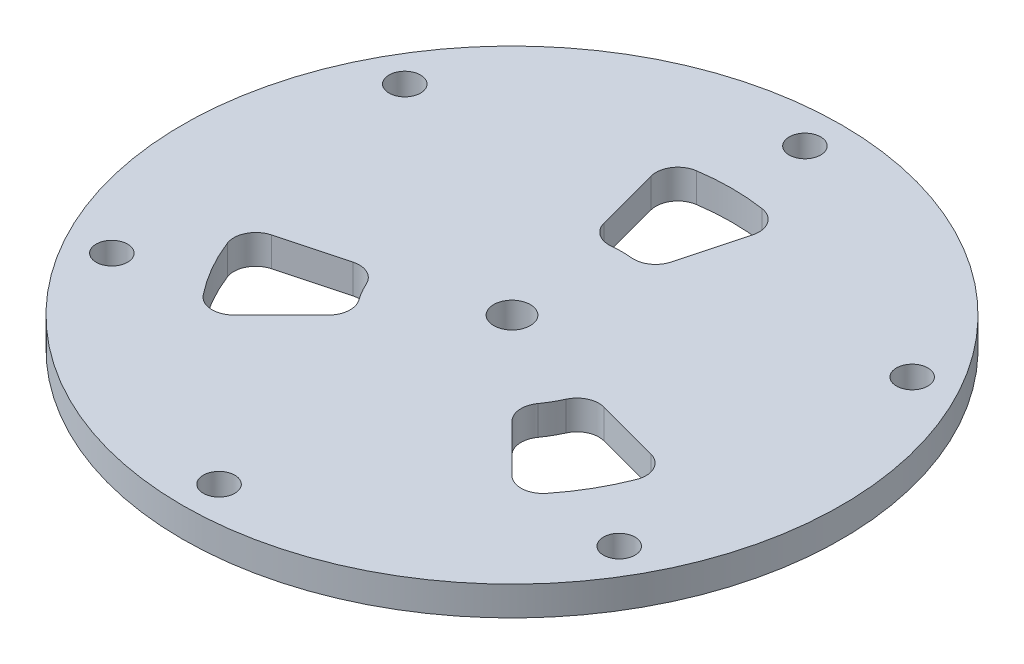
ISO-10303-21;
HEADER;
FILE_DESCRIPTION(('STEP AP214'),'2;1');
FILE_NAME('part.step','',(''),(''),'','','');
FILE_SCHEMA(('AUTOMOTIVE_DESIGN { 1 0 10303 214 1 1 1 1 }'));
ENDSEC;
DATA;
#1=APPLICATION_CONTEXT('core data for automotive mechanical design processes');
#2=APPLICATION_PROTOCOL_DEFINITION('international standard','automotive_design',2000,#1);
#3=PRODUCT_CONTEXT('',#1,'mechanical');
#4=PRODUCT('Part','Part','',(#3));
#5=PRODUCT_RELATED_PRODUCT_CATEGORY('part','',(#4));
#6=PRODUCT_DEFINITION_FORMATION('','',#4);
#7=PRODUCT_DEFINITION_CONTEXT('part definition',#1,'design');
#8=PRODUCT_DEFINITION('design','',#6,#7);
#9=PRODUCT_DEFINITION_SHAPE('','',#8);
#10=(LENGTH_UNIT() NAMED_UNIT(*) SI_UNIT(.MILLI.,.METRE.));
#11=(NAMED_UNIT(*) PLANE_ANGLE_UNIT() SI_UNIT($,.RADIAN.));
#12=(NAMED_UNIT(*) SI_UNIT($,.STERADIAN.) SOLID_ANGLE_UNIT());
#13=UNCERTAINTY_MEASURE_WITH_UNIT(LENGTH_MEASURE(1.E-05),#10,'distance_accuracy_value','');
#14=(GEOMETRIC_REPRESENTATION_CONTEXT(3) GLOBAL_UNCERTAINTY_ASSIGNED_CONTEXT((#13)) GLOBAL_UNIT_ASSIGNED_CONTEXT((#10,
#11,#12)) REPRESENTATION_CONTEXT('',''));
#15=CARTESIAN_POINT('',(0.,0.,0.));
#16=DIRECTION('',(0.,0.,1.));
#17=DIRECTION('',(1.,0.,0.));
#18=AXIS2_PLACEMENT_3D('',#15,#16,#17);
#19=CARTESIAN_POINT('',(0.,2.,0.));
#20=DIRECTION('',(0.,1.,0.));
#21=DIRECTION('',(0.,0.,1.));
#22=AXIS2_PLACEMENT_3D('',#19,#20,#21);
#23=PLANE('',#22);
#24=CARTESIAN_POINT('',(-34.6410161513699,2.,20.0000000000044));
#25=DIRECTION('',(0.,1.,0.));
#26=DIRECTION('',(0.,0.,1.));
#27=AXIS2_PLACEMENT_3D('',#24,#25,#26);
#28=CIRCLE('',#27,2.15);
#29=CARTESIAN_POINT('',(-34.6410161513699,2.,22.1500000000044));
#30=VERTEX_POINT('',#29);
#31=EDGE_CURVE('E384',#30,#30,#28,.T.);
#32=ORIENTED_EDGE('',*,*,#31,.F.);
#33=EDGE_LOOP('',(#32));
#34=FACE_BOUND('',#33,.T.);
#35=CARTESIAN_POINT('',(34.6410161513852,2.,19.9999999999956));
#36=DIRECTION('',(0.,1.,0.));
#37=DIRECTION('',(0.,0.,1.));
#38=AXIS2_PLACEMENT_3D('',#35,#36,#37);
#39=CIRCLE('',#38,2.15);
#40=CARTESIAN_POINT('',(34.6410161513852,2.,22.1499999999956));
#41=VERTEX_POINT('',#40);
#42=EDGE_CURVE('E396',#41,#41,#39,.T.);
#43=ORIENTED_EDGE('',*,*,#42,.F.);
#44=EDGE_LOOP('',(#43));
#45=FACE_BOUND('',#44,.T.);
#46=CARTESIAN_POINT('',(0.,2.,40.));
#47=DIRECTION('',(0.,1.,0.));
#48=DIRECTION('',(0.,0.,-1.));
#49=AXIS2_PLACEMENT_3D('',#46,#47,#48);
#50=CIRCLE('',#49,2.15);
#51=CARTESIAN_POINT('',(0.,2.,37.85));
#52=VERTEX_POINT('',#51);
#53=EDGE_CURVE('E408',#52,#52,#50,.T.);
#54=ORIENTED_EDGE('',*,*,#53,.F.);
#55=EDGE_LOOP('',(#54));
#56=FACE_BOUND('',#55,.T.);
#57=CARTESIAN_POINT('',(0.,2.,0.));
#58=DIRECTION('',(0.,1.,0.));
#59=DIRECTION('',(0.,0.,1.));
#60=AXIS2_PLACEMENT_3D('',#57,#58,#59);
#61=CIRCLE('',#60,45.);
#62=CARTESIAN_POINT('',(0.,2.,45.));
#63=VERTEX_POINT('',#62);
#64=EDGE_CURVE('E11',#63,#63,#61,.T.);
#65=ORIENTED_EDGE('',*,*,#64,.T.);
#66=EDGE_LOOP('',(#65));
#67=FACE_BOUND('',#66,.T.);
#68=CARTESIAN_POINT('',(0.,2.,-40.));
#69=DIRECTION('',(0.,1.,0.));
#70=DIRECTION('',(0.,0.,1.));
#71=AXIS2_PLACEMENT_3D('',#68,#69,#70);
#72=CIRCLE('',#71,2.15);
#73=CARTESIAN_POINT('',(0.,2.,-37.85));
#74=VERTEX_POINT('',#73);
#75=EDGE_CURVE('E414',#74,#74,#72,.T.);
#76=ORIENTED_EDGE('',*,*,#75,.F.);
#77=EDGE_LOOP('',(#76));
#78=FACE_BOUND('',#77,.T.);
#79=CARTESIAN_POINT('',(0.,2.,0.));
#80=DIRECTION('',(0.,1.,0.));
#81=DIRECTION('',(0.,0.,1.));
#82=AXIS2_PLACEMENT_3D('',#79,#80,#81);
#83=CIRCLE('',#82,2.5);
#84=CARTESIAN_POINT('',(0.,2.,2.5));
#85=VERTEX_POINT('',#84);
#86=EDGE_CURVE('E402',#85,#85,#83,.T.);
#87=ORIENTED_EDGE('',*,*,#86,.F.);
#88=EDGE_LOOP('',(#87));
#89=FACE_BOUND('',#88,.T.);
#90=CARTESIAN_POINT('',(-34.6410161513699,2.,-20.0000000000044));
#91=DIRECTION('',(0.,1.,0.));
#92=DIRECTION('',(0.,0.,-1.));
#93=AXIS2_PLACEMENT_3D('',#90,#91,#92);
#94=CIRCLE('',#93,2.15);
#95=CARTESIAN_POINT('',(-34.6410161513699,2.,-22.1500000000044));
#96=VERTEX_POINT('',#95);
#97=EDGE_CURVE('E390',#96,#96,#94,.T.);
#98=ORIENTED_EDGE('',*,*,#97,.F.);
#99=EDGE_LOOP('',(#98));
#100=FACE_BOUND('',#99,.T.);
#101=CARTESIAN_POINT('',(34.6410161513852,2.,-19.9999999999956));
#102=DIRECTION('',(0.,1.,0.));
#103=DIRECTION('',(0.,0.,-1.));
#104=AXIS2_PLACEMENT_3D('',#101,#102,#103);
#105=CIRCLE('',#104,2.15);
#106=CARTESIAN_POINT('',(34.6410161513852,2.,-22.1499999999956));
#107=VERTEX_POINT('',#106);
#108=EDGE_CURVE('E378',#107,#107,#105,.T.);
#109=ORIENTED_EDGE('',*,*,#108,.F.);
#110=EDGE_LOOP('',(#109));
#111=FACE_BOUND('',#110,.T.);
#112=CARTESIAN_POINT('',(0.,2.,0.));
#113=DIRECTION('',(0.,1.,0.));
#114=DIRECTION('',(0.,0.,-1.));
#115=AXIS2_PLACEMENT_3D('',#112,#113,#114);
#116=CIRCLE('',#115,30.);
#117=CARTESIAN_POINT('',(23.4388736717443,2.,18.7248284638342));
#118=VERTEX_POINT('',#117);
#119=CARTESIAN_POINT('',(27.9356139670585,2.,10.9362458039078));
#120=VERTEX_POINT('',#119);
#121=EDGE_CURVE('E321',#118,#120,#116,.T.);
#122=ORIENTED_EDGE('',*,*,#121,.F.);
#123=CARTESIAN_POINT('',(21.0949863045698,2.,16.8523456174508));
#124=DIRECTION('',(0.,1.,0.));
#125=DIRECTION('',(0.,0.,1.));
#126=AXIS2_PLACEMENT_3D('',#123,#124,#125);
#127=CIRCLE('',#126,3.);
#128=CARTESIAN_POINT('',(18.9736659610102,2.,18.9736659610104));
#129=VERTEX_POINT('',#128);
#130=EDGE_CURVE('E319',#129,#118,#127,.T.);
#131=ORIENTED_EDGE('',*,*,#130,.F.);
#132=DIRECTION('',(0.707106781186544,0.,0.707106781186551));
#133=VECTOR('',#132,1.);
#134=CARTESIAN_POINT('',(18.9736659610102,2.,18.9736659610104));
#135=LINE('',#134,#133);
#136=CARTESIAN_POINT('',(12.5499003980111,2.,12.5499003980112));
#137=VERTEX_POINT('',#136);
#138=EDGE_CURVE('E335',#137,#129,#135,.T.);
#139=ORIENTED_EDGE('',*,*,#138,.F.);
#140=CARTESIAN_POINT('',(14.6712207415707,2.,10.4285800544516));
#141=DIRECTION('',(0.,1.,0.));
#142=DIRECTION('',(0.,0.,1.));
#143=AXIS2_PLACEMENT_3D('',#140,#141,#142);
#144=CIRCLE('',#143,3.);
#145=CARTESIAN_POINT('',(12.2260172846423,2.,8.69048337870965));
#146=VERTEX_POINT('',#145);
#147=EDGE_CURVE('E332',#146,#137,#144,.T.);
#148=ORIENTED_EDGE('',*,*,#147,.F.);
#149=CARTESIAN_POINT('',(0.,2.,0.));
#150=DIRECTION('',(0.,-1.,0.));
#151=DIRECTION('',(0.,0.,-1.));
#152=AXIS2_PLACEMENT_3D('',#149,#150,#151);
#153=CIRCLE('',#152,15.);
#154=CARTESIAN_POINT('',(13.6391880194501,2.,6.24279986625309));
#155=VERTEX_POINT('',#154);
#156=EDGE_CURVE('E330',#155,#146,#153,.T.);
#157=ORIENTED_EDGE('',*,*,#156,.F.);
#158=CARTESIAN_POINT('',(16.3670256233401,2.,7.49135983950378));
#159=DIRECTION('',(0.,1.,0.));
#160=DIRECTION('',(0.,0.,-1.));
#161=AXIS2_PLACEMENT_3D('',#158,#159,#160);
#162=CIRCLE('',#161,3.00000000000005);
#163=CARTESIAN_POINT('',(17.1434827586476,2.,4.59358236063654));
#164=VERTEX_POINT('',#163);
#165=EDGE_CURVE('E328',#164,#155,#162,.T.);
#166=ORIENTED_EDGE('',*,*,#165,.F.);
#167=DIRECTION('',(-0.965925826289069,0.,-0.25881904510252));
#168=VECTOR('',#167,1.);
#169=CARTESIAN_POINT('',(25.9185097056601,2.,6.94484374464982));
#170=LINE('',#169,#168);
#171=CARTESIAN_POINT('',(25.9185097056601,2.,6.94484374464982));
#172=VERTEX_POINT('',#171);
#173=EDGE_CURVE('E326',#172,#164,#170,.T.);
#174=ORIENTED_EDGE('',*,*,#173,.F.);
#175=CARTESIAN_POINT('',(25.1420525703525,2.,9.84262122351715));
#176=DIRECTION('',(0.,1.,0.));
#177=DIRECTION('',(0.,0.,1.));
#178=AXIS2_PLACEMENT_3D('',#175,#176,#177);
#179=CIRCLE('',#178,3.00000000000006);
#180=EDGE_CURVE('E324',#120,#172,#179,.T.);
#181=ORIENTED_EDGE('',*,*,#180,.F.);
#182=EDGE_LOOP('',(#122,#131,#139,#148,#157,#166,#174,#181));
#183=FACE_BOUND('',#182,.T.);
#184=CARTESIAN_POINT('',(0.,2.,0.));
#185=DIRECTION('',(0.,1.,0.));
#186=DIRECTION('',(0.,0.,-1.));
#187=AXIS2_PLACEMENT_3D('',#184,#185,#186);
#188=CIRCLE('',#187,30.);
#189=CARTESIAN_POINT('',(-27.9356139670584,2.,10.9362458039078));
#190=VERTEX_POINT('',#189);
#191=CARTESIAN_POINT('',(-23.4388736717445,2.,18.7248284638338));
#192=VERTEX_POINT('',#191);
#193=EDGE_CURVE('E262',#190,#192,#188,.T.);
#194=ORIENTED_EDGE('',*,*,#193,.F.);
#195=CARTESIAN_POINT('',(-25.1420525703527,2.,9.8426212235168));
#196=DIRECTION('',(0.,1.,0.));
#197=DIRECTION('',(0.,0.,1.));
#198=AXIS2_PLACEMENT_3D('',#195,#196,#197);
#199=CIRCLE('',#198,2.99999999999988);
#200=CARTESIAN_POINT('',(-25.9185097056601,2.,6.94484374464982));
#201=VERTEX_POINT('',#200);
#202=EDGE_CURVE('E260',#201,#190,#199,.T.);
#203=ORIENTED_EDGE('',*,*,#202,.F.);
#204=DIRECTION('',(-0.965925826289069,0.,0.25881904510252));
#205=VECTOR('',#204,1.);
#206=CARTESIAN_POINT('',(-25.9185097056601,2.,6.94484374464982));
#207=LINE('',#206,#205);
#208=CARTESIAN_POINT('',(-17.1434827586476,2.,4.59358236063649));
#209=VERTEX_POINT('',#208);
#210=EDGE_CURVE('E276',#209,#201,#207,.T.);
#211=ORIENTED_EDGE('',*,*,#210,.F.);
#212=CARTESIAN_POINT('',(-16.3670256233402,2.,7.49135983950356));
#213=DIRECTION('',(0.,1.,0.));
#214=DIRECTION('',(0.,0.,1.));
#215=AXIS2_PLACEMENT_3D('',#212,#213,#214);
#216=CIRCLE('',#215,2.99999999999992);
#217=CARTESIAN_POINT('',(-13.6391880194501,2.,6.24279986625312));
#218=VERTEX_POINT('',#217);
#219=EDGE_CURVE('E273',#218,#209,#216,.T.);
#220=ORIENTED_EDGE('',*,*,#219,.F.);
#221=CARTESIAN_POINT('',(0.,2.,0.));
#222=DIRECTION('',(0.,-1.,0.));
#223=DIRECTION('',(0.,0.,-1.));
#224=AXIS2_PLACEMENT_3D('',#221,#222,#223);
#225=CIRCLE('',#224,15.);
#226=CARTESIAN_POINT('',(-12.2260172846424,2.,8.69048337870948));
#227=VERTEX_POINT('',#226);
#228=EDGE_CURVE('E271',#227,#218,#225,.T.);
#229=ORIENTED_EDGE('',*,*,#228,.F.);
#230=CARTESIAN_POINT('',(-14.6712207415709,2.,10.4285800544514));
#231=DIRECTION('',(0.,1.,0.));
#232=DIRECTION('',(0.,0.,1.));
#233=AXIS2_PLACEMENT_3D('',#230,#231,#232);
#234=CIRCLE('',#233,3.);
#235=CARTESIAN_POINT('',(-12.5499003980112,2.,12.549900398011));
#236=VERTEX_POINT('',#235);
#237=EDGE_CURVE('E269',#236,#227,#234,.T.);
#238=ORIENTED_EDGE('',*,*,#237,.F.);
#239=DIRECTION('',(0.707106781186554,0.,-0.707106781186541));
#240=VECTOR('',#239,1.);
#241=CARTESIAN_POINT('',(-18.9736659610104,2.,18.9736659610101));
#242=LINE('',#241,#240);
#243=CARTESIAN_POINT('',(-18.9736659610104,2.,18.9736659610101));
#244=VERTEX_POINT('',#243);
#245=EDGE_CURVE('E267',#244,#236,#242,.T.);
#246=ORIENTED_EDGE('',*,*,#245,.F.);
#247=CARTESIAN_POINT('',(-21.0949863045701,2.,16.8523456174504));
#248=DIRECTION('',(0.,1.,0.));
#249=DIRECTION('',(0.,0.,1.));
#250=AXIS2_PLACEMENT_3D('',#247,#248,#249);
#251=CIRCLE('',#250,3.00000000000001);
#252=EDGE_CURVE('E265',#192,#244,#251,.T.);
#253=ORIENTED_EDGE('',*,*,#252,.F.);
#254=EDGE_LOOP('',(#194,#203,#211,#220,#229,#238,#246,#253));
#255=FACE_BOUND('',#254,.T.);
#256=DIRECTION('',(0.258819045102521,0.,-0.965925826289068));
#257=VECTOR('',#256,1.);
#258=CARTESIAN_POINT('',(6.94484374464986,2.,-25.9185097056601));
#259=LINE('',#258,#257);
#260=CARTESIAN_POINT('',(4.59358236063652,2.,-17.1434827586476));
#261=VERTEX_POINT('',#260);
#262=CARTESIAN_POINT('',(6.94484374464986,2.,-25.9185097056601));
#263=VERTEX_POINT('',#262);
#264=EDGE_CURVE('E203',#261,#263,#259,.T.);
#265=ORIENTED_EDGE('',*,*,#264,.F.);
#266=CARTESIAN_POINT('',(1.69580488176932,2.,-17.9199398939552));
#267=DIRECTION('',(0.,1.,0.));
#268=DIRECTION('',(0.,0.,1.));
#269=AXIS2_PLACEMENT_3D('',#266,#267,#268);
#270=CIRCLE('',#269,3.);
#271=CARTESIAN_POINT('',(1.41317073480777,2.,-14.9332832449627));
#272=VERTEX_POINT('',#271);
#273=EDGE_CURVE('E195',#272,#261,#270,.T.);
#274=ORIENTED_EDGE('',*,*,#273,.F.);
#275=CARTESIAN_POINT('',(0.,2.,0.));
#276=DIRECTION('',(0.,-1.,0.));
#277=DIRECTION('',(0.,0.,-1.));
#278=AXIS2_PLACEMENT_3D('',#275,#276,#277);
#279=CIRCLE('',#278,15.);
#280=CARTESIAN_POINT('',(-1.41317073480778,2.,-14.9332832449627));
#281=VERTEX_POINT('',#280);
#282=EDGE_CURVE('E228',#281,#272,#279,.T.);
#283=ORIENTED_EDGE('',*,*,#282,.F.);
#284=CARTESIAN_POINT('',(-1.69580488176932,2.,-17.9199398939552));
#285=DIRECTION('',(0.,1.,0.));
#286=DIRECTION('',(0.,0.,1.));
#287=AXIS2_PLACEMENT_3D('',#284,#285,#286);
#288=CIRCLE('',#287,3.);
#289=CARTESIAN_POINT('',(-4.59358236063652,2.,-17.1434827586476));
#290=VERTEX_POINT('',#289);
#291=EDGE_CURVE('E226',#290,#281,#288,.T.);
#292=ORIENTED_EDGE('',*,*,#291,.F.);
#293=DIRECTION('',(0.258819045102521,0.,0.965925826289068));
#294=VECTOR('',#293,1.);
#295=CARTESIAN_POINT('',(-6.94484374464986,2.,-25.9185097056601));
#296=LINE('',#295,#294);
#297=CARTESIAN_POINT('',(-6.94484374464986,2.,-25.9185097056601));
#298=VERTEX_POINT('',#297);
#299=EDGE_CURVE('E224',#298,#290,#296,.T.);
#300=ORIENTED_EDGE('',*,*,#299,.F.);
#301=CARTESIAN_POINT('',(-4.04706626578266,2.,-26.6949668409677));
#302=DIRECTION('',(0.,1.,0.));
#303=DIRECTION('',(0.,0.,-1.));
#304=AXIS2_PLACEMENT_3D('',#301,#302,#303);
#305=CIRCLE('',#304,3.);
#306=CARTESIAN_POINT('',(-4.49674029531407,2.,-29.6610742677419));
#307=VERTEX_POINT('',#306);
#308=EDGE_CURVE('E222',#307,#298,#305,.T.);
#309=ORIENTED_EDGE('',*,*,#308,.F.);
#310=CARTESIAN_POINT('',(0.,2.,0.));
#311=DIRECTION('',(0.,1.,0.));
#312=DIRECTION('',(0.,0.,-1.));
#313=AXIS2_PLACEMENT_3D('',#310,#311,#312);
#314=CIRCLE('',#313,30.);
#315=CARTESIAN_POINT('',(4.49674029531408,2.,-29.6610742677419));
#316=VERTEX_POINT('',#315);
#317=EDGE_CURVE('E218',#316,#307,#314,.T.);
#318=ORIENTED_EDGE('',*,*,#317,.F.);
#319=CARTESIAN_POINT('',(4.04706626578266,2.,-26.6949668409677));
#320=DIRECTION('',(0.,1.,0.));
#321=DIRECTION('',(0.,0.,1.));
#322=AXIS2_PLACEMENT_3D('',#319,#320,#321);
#323=CIRCLE('',#322,3.);
#324=EDGE_CURVE('E216',#263,#316,#323,.T.);
#325=ORIENTED_EDGE('',*,*,#324,.F.);
#326=EDGE_LOOP('',(#265,#274,#283,#292,#300,#309,#318,#325));
#327=FACE_BOUND('',#326,.T.);
#328=ADVANCED_FACE('F34',(#34,#45,#56,#67,#78,#89,#100,#111,#183,#255,#327),#23,.T.);
#329=CARTESIAN_POINT('',(0.,-2.,0.));
#330=DIRECTION('',(0.,1.,0.));
#331=DIRECTION('',(0.,0.,1.));
#332=AXIS2_PLACEMENT_3D('',#329,#330,#331);
#333=PLANE('',#332);
#334=CARTESIAN_POINT('',(-25.1420525703527,-2.,9.8426212235168));
#335=DIRECTION('',(0.,1.,0.));
#336=DIRECTION('',(0.,0.,1.));
#337=AXIS2_PLACEMENT_3D('',#334,#335,#336);
#338=CIRCLE('',#337,2.99999999999988);
#339=CARTESIAN_POINT('',(-25.9185097056601,-2.,6.94484374464982));
#340=VERTEX_POINT('',#339);
#341=CARTESIAN_POINT('',(-27.9356139670584,-2.,10.9362458039078));
#342=VERTEX_POINT('',#341);
#343=EDGE_CURVE('E211',#340,#342,#338,.T.);
#344=ORIENTED_EDGE('',*,*,#343,.T.);
#345=CARTESIAN_POINT('',(0.,-2.,0.));
#346=DIRECTION('',(0.,1.,0.));
#347=DIRECTION('',(0.,0.,-1.));
#348=AXIS2_PLACEMENT_3D('',#345,#346,#347);
#349=CIRCLE('',#348,30.);
#350=CARTESIAN_POINT('',(-23.4388736717445,-2.,18.7248284638338));
#351=VERTEX_POINT('',#350);
#352=EDGE_CURVE('E281',#342,#351,#349,.T.);
#353=ORIENTED_EDGE('',*,*,#352,.T.);
#354=CARTESIAN_POINT('',(-21.0949863045701,-2.,16.8523456174504));
#355=DIRECTION('',(0.,1.,0.));
#356=DIRECTION('',(0.,0.,1.));
#357=AXIS2_PLACEMENT_3D('',#354,#355,#356);
#358=CIRCLE('',#357,3.00000000000001);
#359=CARTESIAN_POINT('',(-18.9736659610104,-2.,18.9736659610101));
#360=VERTEX_POINT('',#359);
#361=EDGE_CURVE('E284',#351,#360,#358,.T.);
#362=ORIENTED_EDGE('',*,*,#361,.T.);
#363=DIRECTION('',(0.707106781186554,0.,-0.707106781186541));
#364=VECTOR('',#363,1.);
#365=CARTESIAN_POINT('',(-18.9736659610104,-2.,18.9736659610101));
#366=LINE('',#365,#364);
#367=CARTESIAN_POINT('',(-12.5499003980112,-2.,12.549900398011));
#368=VERTEX_POINT('',#367);
#369=EDGE_CURVE('E287',#360,#368,#366,.T.);
#370=ORIENTED_EDGE('',*,*,#369,.T.);
#371=CARTESIAN_POINT('',(-14.6712207415709,-2.,10.4285800544514));
#372=DIRECTION('',(0.,1.,0.));
#373=DIRECTION('',(0.,0.,1.));
#374=AXIS2_PLACEMENT_3D('',#371,#372,#373);
#375=CIRCLE('',#374,3.);
#376=CARTESIAN_POINT('',(-12.2260172846424,-2.,8.69048337870948));
#377=VERTEX_POINT('',#376);
#378=EDGE_CURVE('E290',#368,#377,#375,.T.);
#379=ORIENTED_EDGE('',*,*,#378,.T.);
#380=CARTESIAN_POINT('',(0.,-2.,0.));
#381=DIRECTION('',(0.,-1.,0.));
#382=DIRECTION('',(0.,0.,-1.));
#383=AXIS2_PLACEMENT_3D('',#380,#381,#382);
#384=CIRCLE('',#383,15.);
#385=CARTESIAN_POINT('',(-13.6391880194501,-2.,6.24279986625312));
#386=VERTEX_POINT('',#385);
#387=EDGE_CURVE('E293',#377,#386,#384,.T.);
#388=ORIENTED_EDGE('',*,*,#387,.T.);
#389=CARTESIAN_POINT('',(-16.3670256233402,-2.,7.49135983950356));
#390=DIRECTION('',(0.,1.,0.));
#391=DIRECTION('',(0.,0.,1.));
#392=AXIS2_PLACEMENT_3D('',#389,#390,#391);
#393=CIRCLE('',#392,2.99999999999992);
#394=CARTESIAN_POINT('',(-17.1434827586476,-2.,4.59358236063649));
#395=VERTEX_POINT('',#394);
#396=EDGE_CURVE('E296',#386,#395,#393,.T.);
#397=ORIENTED_EDGE('',*,*,#396,.T.);
#398=DIRECTION('',(-0.965925826289069,0.,0.25881904510252));
#399=VECTOR('',#398,1.);
#400=CARTESIAN_POINT('',(-25.9185097056601,-2.,6.94484374464982));
#401=LINE('',#400,#399);
#402=EDGE_CURVE('E263',#395,#340,#401,.T.);
#403=ORIENTED_EDGE('',*,*,#402,.T.);
#404=EDGE_LOOP('',(#344,#353,#362,#370,#379,#388,#397,#403));
#405=FACE_BOUND('',#404,.T.);
#406=CARTESIAN_POINT('',(34.6410161513852,-2.,-19.9999999999956));
#407=DIRECTION('',(0.,1.,0.));
#408=DIRECTION('',(0.,0.,-1.));
#409=AXIS2_PLACEMENT_3D('',#406,#407,#408);
#410=CIRCLE('',#409,2.15);
#411=CARTESIAN_POINT('',(34.6410161513852,-2.,-22.1499999999956));
#412=VERTEX_POINT('',#411);
#413=EDGE_CURVE('E377',#412,#412,#410,.T.);
#414=ORIENTED_EDGE('',*,*,#413,.T.);
#415=EDGE_LOOP('',(#414));
#416=FACE_BOUND('',#415,.T.);
#417=CARTESIAN_POINT('',(-34.6410161513699,-2.,20.0000000000044));
#418=DIRECTION('',(0.,1.,0.));
#419=DIRECTION('',(0.,0.,1.));
#420=AXIS2_PLACEMENT_3D('',#417,#418,#419);
#421=CIRCLE('',#420,2.15);
#422=CARTESIAN_POINT('',(-34.6410161513699,-2.,22.1500000000044));
#423=VERTEX_POINT('',#422);
#424=EDGE_CURVE('E381',#423,#423,#421,.T.);
#425=ORIENTED_EDGE('',*,*,#424,.T.);
#426=EDGE_LOOP('',(#425));
#427=FACE_BOUND('',#426,.T.);
#428=CARTESIAN_POINT('',(-34.6410161513699,-2.,-20.0000000000044));
#429=DIRECTION('',(0.,1.,0.));
#430=DIRECTION('',(0.,0.,-1.));
#431=AXIS2_PLACEMENT_3D('',#428,#429,#430);
#432=CIRCLE('',#431,2.15);
#433=CARTESIAN_POINT('',(-34.6410161513699,-2.,-22.1500000000044));
#434=VERTEX_POINT('',#433);
#435=EDGE_CURVE('E387',#434,#434,#432,.T.);
#436=ORIENTED_EDGE('',*,*,#435,.T.);
#437=EDGE_LOOP('',(#436));
#438=FACE_BOUND('',#437,.T.);
#439=CARTESIAN_POINT('',(34.6410161513852,-2.,19.9999999999956));
#440=DIRECTION('',(0.,1.,0.));
#441=DIRECTION('',(0.,0.,1.));
#442=AXIS2_PLACEMENT_3D('',#439,#440,#441);
#443=CIRCLE('',#442,2.15);
#444=CARTESIAN_POINT('',(34.6410161513852,-2.,22.1499999999956));
#445=VERTEX_POINT('',#444);
#446=EDGE_CURVE('E393',#445,#445,#443,.T.);
#447=ORIENTED_EDGE('',*,*,#446,.T.);
#448=EDGE_LOOP('',(#447));
#449=FACE_BOUND('',#448,.T.);
#450=CARTESIAN_POINT('',(0.,-2.,0.));
#451=DIRECTION('',(0.,1.,0.));
#452=DIRECTION('',(0.,0.,1.));
#453=AXIS2_PLACEMENT_3D('',#450,#451,#452);
#454=CIRCLE('',#453,2.5);
#455=CARTESIAN_POINT('',(0.,-2.,2.5));
#456=VERTEX_POINT('',#455);
#457=EDGE_CURVE('E399',#456,#456,#454,.T.);
#458=ORIENTED_EDGE('',*,*,#457,.T.);
#459=EDGE_LOOP('',(#458));
#460=FACE_BOUND('',#459,.T.);
#461=CARTESIAN_POINT('',(0.,-2.,40.));
#462=DIRECTION('',(0.,1.,0.));
#463=DIRECTION('',(0.,0.,-1.));
#464=AXIS2_PLACEMENT_3D('',#461,#462,#463);
#465=CIRCLE('',#464,2.15);
#466=CARTESIAN_POINT('',(0.,-2.,37.85));
#467=VERTEX_POINT('',#466);
#468=EDGE_CURVE('E405',#467,#467,#465,.T.);
#469=ORIENTED_EDGE('',*,*,#468,.T.);
#470=EDGE_LOOP('',(#469));
#471=FACE_BOUND('',#470,.T.);
#472=CARTESIAN_POINT('',(0.,-2.,-40.));
#473=DIRECTION('',(0.,1.,0.));
#474=DIRECTION('',(0.,0.,1.));
#475=AXIS2_PLACEMENT_3D('',#472,#473,#474);
#476=CIRCLE('',#475,2.15);
#477=CARTESIAN_POINT('',(0.,-2.,-37.85));
#478=VERTEX_POINT('',#477);
#479=EDGE_CURVE('E411',#478,#478,#476,.T.);
#480=ORIENTED_EDGE('',*,*,#479,.T.);
#481=EDGE_LOOP('',(#480));
#482=FACE_BOUND('',#481,.T.);
#483=CARTESIAN_POINT('',(0.,-2.,0.));
#484=DIRECTION('',(0.,1.,0.));
#485=DIRECTION('',(0.,0.,1.));
#486=AXIS2_PLACEMENT_3D('',#483,#484,#485);
#487=CIRCLE('',#486,45.);
#488=CARTESIAN_POINT('',(0.,-2.,45.));
#489=VERTEX_POINT('',#488);
#490=EDGE_CURVE('E38',#489,#489,#487,.T.);
#491=ORIENTED_EDGE('',*,*,#490,.F.);
#492=EDGE_LOOP('',(#491));
#493=FACE_BOUND('',#492,.T.);
#494=CARTESIAN_POINT('',(21.0949863045698,-2.,16.8523456174508));
#495=DIRECTION('',(0.,1.,0.));
#496=DIRECTION('',(0.,0.,1.));
#497=AXIS2_PLACEMENT_3D('',#494,#495,#496);
#498=CIRCLE('',#497,3.);
#499=CARTESIAN_POINT('',(18.9736659610102,-2.,18.9736659610104));
#500=VERTEX_POINT('',#499);
#501=CARTESIAN_POINT('',(23.4388736717443,-2.,18.7248284638342));
#502=VERTEX_POINT('',#501);
#503=EDGE_CURVE('E318',#500,#502,#498,.T.);
#504=ORIENTED_EDGE('',*,*,#503,.T.);
#505=CARTESIAN_POINT('',(0.,-2.,0.));
#506=DIRECTION('',(0.,1.,0.));
#507=DIRECTION('',(0.,0.,-1.));
#508=AXIS2_PLACEMENT_3D('',#505,#506,#507);
#509=CIRCLE('',#508,30.);
#510=CARTESIAN_POINT('',(27.9356139670585,-2.,10.9362458039078));
#511=VERTEX_POINT('',#510);
#512=EDGE_CURVE('E340',#502,#511,#509,.T.);
#513=ORIENTED_EDGE('',*,*,#512,.T.);
#514=CARTESIAN_POINT('',(25.1420525703525,-2.,9.84262122351715));
#515=DIRECTION('',(0.,1.,0.));
#516=DIRECTION('',(0.,0.,1.));
#517=AXIS2_PLACEMENT_3D('',#514,#515,#516);
#518=CIRCLE('',#517,3.00000000000006);
#519=CARTESIAN_POINT('',(25.9185097056601,-2.,6.94484374464982));
#520=VERTEX_POINT('',#519);
#521=EDGE_CURVE('E343',#511,#520,#518,.T.);
#522=ORIENTED_EDGE('',*,*,#521,.T.);
#523=DIRECTION('',(-0.965925826289069,0.,-0.25881904510252));
#524=VECTOR('',#523,1.);
#525=CARTESIAN_POINT('',(25.9185097056601,-2.,6.94484374464982));
#526=LINE('',#525,#524);
#527=CARTESIAN_POINT('',(17.1434827586476,-2.,4.59358236063654));
#528=VERTEX_POINT('',#527);
#529=EDGE_CURVE('E346',#520,#528,#526,.T.);
#530=ORIENTED_EDGE('',*,*,#529,.T.);
#531=CARTESIAN_POINT('',(16.3670256233401,-2.,7.49135983950378));
#532=DIRECTION('',(0.,1.,0.));
#533=DIRECTION('',(0.,0.,-1.));
#534=AXIS2_PLACEMENT_3D('',#531,#532,#533);
#535=CIRCLE('',#534,3.00000000000005);
#536=CARTESIAN_POINT('',(13.6391880194501,-2.,6.24279986625309));
#537=VERTEX_POINT('',#536);
#538=EDGE_CURVE('E349',#528,#537,#535,.T.);
#539=ORIENTED_EDGE('',*,*,#538,.T.);
#540=CARTESIAN_POINT('',(0.,-2.,0.));
#541=DIRECTION('',(0.,-1.,0.));
#542=DIRECTION('',(0.,0.,-1.));
#543=AXIS2_PLACEMENT_3D('',#540,#541,#542);
#544=CIRCLE('',#543,15.);
#545=CARTESIAN_POINT('',(12.2260172846423,-2.,8.69048337870965));
#546=VERTEX_POINT('',#545);
#547=EDGE_CURVE('E352',#537,#546,#544,.T.);
#548=ORIENTED_EDGE('',*,*,#547,.T.);
#549=CARTESIAN_POINT('',(14.6712207415707,-2.,10.4285800544516));
#550=DIRECTION('',(0.,1.,0.));
#551=DIRECTION('',(0.,0.,1.));
#552=AXIS2_PLACEMENT_3D('',#549,#550,#551);
#553=CIRCLE('',#552,3.);
#554=CARTESIAN_POINT('',(12.5499003980111,-2.,12.5499003980112));
#555=VERTEX_POINT('',#554);
#556=EDGE_CURVE('E355',#546,#555,#553,.T.);
#557=ORIENTED_EDGE('',*,*,#556,.T.);
#558=DIRECTION('',(0.707106781186544,0.,0.707106781186551));
#559=VECTOR('',#558,1.);
#560=CARTESIAN_POINT('',(18.9736659610102,-2.,18.9736659610104));
#561=LINE('',#560,#559);
#562=EDGE_CURVE('E322',#555,#500,#561,.T.);
#563=ORIENTED_EDGE('',*,*,#562,.T.);
#564=EDGE_LOOP('',(#504,#513,#522,#530,#539,#548,#557,#563));
#565=FACE_BOUND('',#564,.T.);
#566=CARTESIAN_POINT('',(1.69580488176932,-2.,-17.9199398939552));
#567=DIRECTION('',(0.,1.,0.));
#568=DIRECTION('',(0.,0.,1.));
#569=AXIS2_PLACEMENT_3D('',#566,#567,#568);
#570=CIRCLE('',#569,3.);
#571=CARTESIAN_POINT('',(1.41317073480777,-2.,-14.9332832449627));
#572=VERTEX_POINT('',#571);
#573=CARTESIAN_POINT('',(4.59358236063652,-2.,-17.1434827586476));
#574=VERTEX_POINT('',#573);
#575=EDGE_CURVE('E57',#572,#574,#570,.T.);
#576=ORIENTED_EDGE('',*,*,#575,.T.);
#577=DIRECTION('',(0.258819045102521,0.,-0.965925826289068));
#578=VECTOR('',#577,1.);
#579=CARTESIAN_POINT('',(6.94484374464986,-2.,-25.9185097056601));
#580=LINE('',#579,#578);
#581=CARTESIAN_POINT('',(6.94484374464986,-2.,-25.9185097056601));
#582=VERTEX_POINT('',#581);
#583=EDGE_CURVE('E210',#574,#582,#580,.T.);
#584=ORIENTED_EDGE('',*,*,#583,.T.);
#585=CARTESIAN_POINT('',(4.04706626578266,-2.,-26.6949668409677));
#586=DIRECTION('',(0.,1.,0.));
#587=DIRECTION('',(0.,0.,1.));
#588=AXIS2_PLACEMENT_3D('',#585,#586,#587);
#589=CIRCLE('',#588,3.);
#590=CARTESIAN_POINT('',(4.49674029531408,-2.,-29.6610742677419));
#591=VERTEX_POINT('',#590);
#592=EDGE_CURVE('E232',#582,#591,#589,.T.);
#593=ORIENTED_EDGE('',*,*,#592,.T.);
#594=CARTESIAN_POINT('',(0.,-2.,0.));
#595=DIRECTION('',(0.,1.,0.));
#596=DIRECTION('',(0.,0.,-1.));
#597=AXIS2_PLACEMENT_3D('',#594,#595,#596);
#598=CIRCLE('',#597,30.);
#599=CARTESIAN_POINT('',(-4.49674029531407,-2.,-29.6610742677419));
#600=VERTEX_POINT('',#599);
#601=EDGE_CURVE('E235',#591,#600,#598,.T.);
#602=ORIENTED_EDGE('',*,*,#601,.T.);
#603=CARTESIAN_POINT('',(-4.04706626578266,-2.,-26.6949668409677));
#604=DIRECTION('',(0.,1.,0.));
#605=DIRECTION('',(0.,0.,-1.));
#606=AXIS2_PLACEMENT_3D('',#603,#604,#605);
#607=CIRCLE('',#606,3.);
#608=CARTESIAN_POINT('',(-6.94484374464986,-2.,-25.9185097056601));
#609=VERTEX_POINT('',#608);
#610=EDGE_CURVE('E238',#600,#609,#607,.T.);
#611=ORIENTED_EDGE('',*,*,#610,.T.);
#612=DIRECTION('',(0.258819045102521,0.,0.965925826289068));
#613=VECTOR('',#612,1.);
#614=CARTESIAN_POINT('',(-6.94484374464986,-2.,-25.9185097056601));
#615=LINE('',#614,#613);
#616=CARTESIAN_POINT('',(-4.59358236063652,-2.,-17.1434827586476));
#617=VERTEX_POINT('',#616);
#618=EDGE_CURVE('E241',#609,#617,#615,.T.);
#619=ORIENTED_EDGE('',*,*,#618,.T.);
#620=CARTESIAN_POINT('',(-1.69580488176932,-2.,-17.9199398939552));
#621=DIRECTION('',(0.,1.,0.));
#622=DIRECTION('',(0.,0.,1.));
#623=AXIS2_PLACEMENT_3D('',#620,#621,#622);
#624=CIRCLE('',#623,3.);
#625=CARTESIAN_POINT('',(-1.41317073480778,-2.,-14.9332832449627));
#626=VERTEX_POINT('',#625);
#627=EDGE_CURVE('E244',#617,#626,#624,.T.);
#628=ORIENTED_EDGE('',*,*,#627,.T.);
#629=CARTESIAN_POINT('',(0.,-2.,0.));
#630=DIRECTION('',(0.,-1.,0.));
#631=DIRECTION('',(0.,0.,-1.));
#632=AXIS2_PLACEMENT_3D('',#629,#630,#631);
#633=CIRCLE('',#632,15.);
#634=EDGE_CURVE('E204',#626,#572,#633,.T.);
#635=ORIENTED_EDGE('',*,*,#634,.T.);
#636=EDGE_LOOP('',(#576,#584,#593,#602,#611,#619,#628,#635));
#637=FACE_BOUND('',#636,.T.);
#638=ADVANCED_FACE('F420',(#405,#416,#427,#438,#449,#460,#471,#482,#493,#565,#637),#333,.F.);
#639=CARTESIAN_POINT('',(0.,2.,0.));
#640=DIRECTION('',(0.,-1.,0.));
#641=DIRECTION('',(0.,0.,-1.));
#642=AXIS2_PLACEMENT_3D('',#639,#640,#641);
#643=CYLINDRICAL_SURFACE('',#642,45.);
#644=ORIENTED_EDGE('',*,*,#64,.F.);
#645=EDGE_LOOP('',(#644));
#646=FACE_BOUND('',#645,.T.);
#647=ORIENTED_EDGE('',*,*,#490,.T.);
#648=EDGE_LOOP('',(#647));
#649=FACE_BOUND('',#648,.T.);
#650=ADVANCED_FACE('F36',(#646,#649),#643,.T.);
#651=CARTESIAN_POINT('',(0.,2.,-40.));
#652=DIRECTION('',(0.,-1.,0.));
#653=DIRECTION('',(0.,0.,-1.));
#654=AXIS2_PLACEMENT_3D('',#651,#652,#653);
#655=CYLINDRICAL_SURFACE('',#654,2.15);
#656=ORIENTED_EDGE('',*,*,#75,.T.);
#657=EDGE_LOOP('',(#656));
#658=FACE_BOUND('',#657,.T.);
#659=ORIENTED_EDGE('',*,*,#479,.F.);
#660=EDGE_LOOP('',(#659));
#661=FACE_BOUND('',#660,.T.);
#662=ADVANCED_FACE('F423',(#658,#661),#655,.F.);
#663=CARTESIAN_POINT('',(0.,2.,40.));
#664=DIRECTION('',(0.,-1.,0.));
#665=DIRECTION('',(0.,0.,-1.));
#666=AXIS2_PLACEMENT_3D('',#663,#664,#665);
#667=CYLINDRICAL_SURFACE('',#666,2.15);
#668=ORIENTED_EDGE('',*,*,#53,.T.);
#669=EDGE_LOOP('',(#668));
#670=FACE_BOUND('',#669,.T.);
#671=ORIENTED_EDGE('',*,*,#468,.F.);
#672=EDGE_LOOP('',(#671));
#673=FACE_BOUND('',#672,.T.);
#674=ADVANCED_FACE('F425',(#670,#673),#667,.F.);
#675=CARTESIAN_POINT('',(0.,2.,0.));
#676=DIRECTION('',(0.,-1.,0.));
#677=DIRECTION('',(0.,0.,-1.));
#678=AXIS2_PLACEMENT_3D('',#675,#676,#677);
#679=CYLINDRICAL_SURFACE('',#678,2.5);
#680=ORIENTED_EDGE('',*,*,#86,.T.);
#681=EDGE_LOOP('',(#680));
#682=FACE_BOUND('',#681,.T.);
#683=ORIENTED_EDGE('',*,*,#457,.F.);
#684=EDGE_LOOP('',(#683));
#685=FACE_BOUND('',#684,.T.);
#686=ADVANCED_FACE('F432',(#682,#685),#679,.F.);
#687=CARTESIAN_POINT('',(34.6410161513852,2.,19.9999999999956));
#688=DIRECTION('',(0.,-1.,0.));
#689=DIRECTION('',(0.,0.,-1.));
#690=AXIS2_PLACEMENT_3D('',#687,#688,#689);
#691=CYLINDRICAL_SURFACE('',#690,2.15);
#692=ORIENTED_EDGE('',*,*,#42,.T.);
#693=EDGE_LOOP('',(#692));
#694=FACE_BOUND('',#693,.T.);
#695=ORIENTED_EDGE('',*,*,#446,.F.);
#696=EDGE_LOOP('',(#695));
#697=FACE_BOUND('',#696,.T.);
#698=ADVANCED_FACE('F558',(#694,#697),#691,.F.);
#699=CARTESIAN_POINT('',(-34.6410161513699,2.,-20.0000000000044));
#700=DIRECTION('',(0.,-1.,0.));
#701=DIRECTION('',(0.,0.,-1.));
#702=AXIS2_PLACEMENT_3D('',#699,#700,#701);
#703=CYLINDRICAL_SURFACE('',#702,2.15);
#704=ORIENTED_EDGE('',*,*,#97,.T.);
#705=EDGE_LOOP('',(#704));
#706=FACE_BOUND('',#705,.T.);
#707=ORIENTED_EDGE('',*,*,#435,.F.);
#708=EDGE_LOOP('',(#707));
#709=FACE_BOUND('',#708,.T.);
#710=ADVANCED_FACE('F554',(#706,#709),#703,.F.);
#711=CARTESIAN_POINT('',(-34.6410161513699,2.,20.0000000000044));
#712=DIRECTION('',(0.,-1.,0.));
#713=DIRECTION('',(0.,0.,-1.));
#714=AXIS2_PLACEMENT_3D('',#711,#712,#713);
#715=CYLINDRICAL_SURFACE('',#714,2.15);
#716=ORIENTED_EDGE('',*,*,#31,.T.);
#717=EDGE_LOOP('',(#716));
#718=FACE_BOUND('',#717,.T.);
#719=ORIENTED_EDGE('',*,*,#424,.F.);
#720=EDGE_LOOP('',(#719));
#721=FACE_BOUND('',#720,.T.);
#722=ADVANCED_FACE('F550',(#718,#721),#715,.F.);
#723=CARTESIAN_POINT('',(34.6410161513852,2.,-19.9999999999956));
#724=DIRECTION('',(0.,-1.,0.));
#725=DIRECTION('',(0.,0.,-1.));
#726=AXIS2_PLACEMENT_3D('',#723,#724,#725);
#727=CYLINDRICAL_SURFACE('',#726,2.15);
#728=ORIENTED_EDGE('',*,*,#108,.T.);
#729=EDGE_LOOP('',(#728));
#730=FACE_BOUND('',#729,.T.);
#731=ORIENTED_EDGE('',*,*,#413,.F.);
#732=EDGE_LOOP('',(#731));
#733=FACE_BOUND('',#732,.T.);
#734=ADVANCED_FACE('F546',(#730,#733),#727,.F.);
#735=CARTESIAN_POINT('',(21.0949863045698,2.,16.8523456174508));
#736=DIRECTION('',(0.,-1.,0.));
#737=DIRECTION('',(0.,0.,-1.));
#738=AXIS2_PLACEMENT_3D('',#735,#736,#737);
#739=CYLINDRICAL_SURFACE('',#738,3.);
#740=ORIENTED_EDGE('',*,*,#503,.F.);
#741=DIRECTION('',(0.,-1.,0.));
#742=VECTOR('',#741,1.);
#743=CARTESIAN_POINT('',(18.9736659610102,2.,18.9736659610104));
#744=LINE('',#743,#742);
#745=EDGE_CURVE('E337',#129,#500,#744,.T.);
#746=ORIENTED_EDGE('',*,*,#745,.F.);
#747=ORIENTED_EDGE('',*,*,#130,.T.);
#748=DIRECTION('',(0.,-1.,0.));
#749=VECTOR('',#748,1.);
#750=CARTESIAN_POINT('',(23.4388736717443,2.,18.7248284638342));
#751=LINE('',#750,#749);
#752=EDGE_CURVE('E374',#118,#502,#751,.T.);
#753=ORIENTED_EDGE('',*,*,#752,.T.);
#754=EDGE_LOOP('',(#740,#746,#747,#753));
#755=FACE_BOUND('',#754,.T.);
#756=ADVANCED_FACE('F542',(#755),#739,.F.);
#757=CARTESIAN_POINT('',(0.,2.,0.));
#758=DIRECTION('',(0.,-1.,0.));
#759=DIRECTION('',(0.,0.,-1.));
#760=AXIS2_PLACEMENT_3D('',#757,#758,#759);
#761=CYLINDRICAL_SURFACE('',#760,30.);
#762=ORIENTED_EDGE('',*,*,#512,.F.);
#763=ORIENTED_EDGE('',*,*,#752,.F.);
#764=ORIENTED_EDGE('',*,*,#121,.T.);
#765=DIRECTION('',(0.,-1.,0.));
#766=VECTOR('',#765,1.);
#767=CARTESIAN_POINT('',(27.9356139670585,2.,10.9362458039078));
#768=LINE('',#767,#766);
#769=EDGE_CURVE('E372',#120,#511,#768,.T.);
#770=ORIENTED_EDGE('',*,*,#769,.T.);
#771=EDGE_LOOP('',(#762,#763,#764,#770));
#772=FACE_BOUND('',#771,.T.);
#773=ADVANCED_FACE('F538',(#772),#761,.F.);
#774=CARTESIAN_POINT('',(25.1420525703525,2.,9.84262122351715));
#775=DIRECTION('',(0.,-1.,0.));
#776=DIRECTION('',(0.,0.,-1.));
#777=AXIS2_PLACEMENT_3D('',#774,#775,#776);
#778=CYLINDRICAL_SURFACE('',#777,3.00000000000006);
#779=ORIENTED_EDGE('',*,*,#521,.F.);
#780=ORIENTED_EDGE('',*,*,#769,.F.);
#781=ORIENTED_EDGE('',*,*,#180,.T.);
#782=DIRECTION('',(0.,-1.,0.));
#783=VECTOR('',#782,1.);
#784=CARTESIAN_POINT('',(25.9185097056601,2.,6.94484374464982));
#785=LINE('',#784,#783);
#786=EDGE_CURVE('E370',#172,#520,#785,.T.);
#787=ORIENTED_EDGE('',*,*,#786,.T.);
#788=EDGE_LOOP('',(#779,#780,#781,#787));
#789=FACE_BOUND('',#788,.T.);
#790=ADVANCED_FACE('F534',(#789),#778,.F.);
#791=CARTESIAN_POINT('',(25.9185097056601,2.,6.94484374464982));
#792=DIRECTION('',(-0.25881904510252,0.,0.965925826289069));
#793=DIRECTION('',(0.965925826289069,0.,0.25881904510252));
#794=AXIS2_PLACEMENT_3D('',#791,#792,#793);
#795=PLANE('',#794);
#796=ORIENTED_EDGE('',*,*,#529,.F.);
#797=ORIENTED_EDGE('',*,*,#786,.F.);
#798=ORIENTED_EDGE('',*,*,#173,.T.);
#799=DIRECTION('',(0.,-1.,0.));
#800=VECTOR('',#799,1.);
#801=CARTESIAN_POINT('',(17.1434827586476,2.,4.59358236063654));
#802=LINE('',#801,#800);
#803=EDGE_CURVE('E368',#164,#528,#802,.T.);
#804=ORIENTED_EDGE('',*,*,#803,.T.);
#805=EDGE_LOOP('',(#796,#797,#798,#804));
#806=FACE_BOUND('',#805,.T.);
#807=ADVANCED_FACE('F530',(#806),#795,.T.);
#808=CARTESIAN_POINT('',(16.3670256233401,2.,7.49135983950378));
#809=DIRECTION('',(0.,-1.,0.));
#810=DIRECTION('',(0.,0.,-1.));
#811=AXIS2_PLACEMENT_3D('',#808,#809,#810);
#812=CYLINDRICAL_SURFACE('',#811,3.00000000000005);
#813=ORIENTED_EDGE('',*,*,#538,.F.);
#814=ORIENTED_EDGE('',*,*,#803,.F.);
#815=ORIENTED_EDGE('',*,*,#165,.T.);
#816=DIRECTION('',(0.,-1.,0.));
#817=VECTOR('',#816,1.);
#818=CARTESIAN_POINT('',(13.6391880194501,2.,6.24279986625309));
#819=LINE('',#818,#817);
#820=EDGE_CURVE('E366',#155,#537,#819,.T.);
#821=ORIENTED_EDGE('',*,*,#820,.T.);
#822=EDGE_LOOP('',(#813,#814,#815,#821));
#823=FACE_BOUND('',#822,.T.);
#824=ADVANCED_FACE('F526',(#823),#812,.F.);
#825=CARTESIAN_POINT('',(0.,2.,0.));
#826=DIRECTION('',(0.,-1.,0.));
#827=DIRECTION('',(0.,0.,-1.));
#828=AXIS2_PLACEMENT_3D('',#825,#826,#827);
#829=CYLINDRICAL_SURFACE('',#828,15.);
#830=ORIENTED_EDGE('',*,*,#547,.F.);
#831=ORIENTED_EDGE('',*,*,#820,.F.);
#832=ORIENTED_EDGE('',*,*,#156,.T.);
#833=DIRECTION('',(0.,-1.,0.));
#834=VECTOR('',#833,1.);
#835=CARTESIAN_POINT('',(12.2260172846423,2.,8.69048337870965));
#836=LINE('',#835,#834);
#837=EDGE_CURVE('E364',#146,#546,#836,.T.);
#838=ORIENTED_EDGE('',*,*,#837,.T.);
#839=EDGE_LOOP('',(#830,#831,#832,#838));
#840=FACE_BOUND('',#839,.T.);
#841=ADVANCED_FACE('F522',(#840),#829,.T.);
#842=CARTESIAN_POINT('',(14.6712207415707,2.,10.4285800544516));
#843=DIRECTION('',(0.,-1.,0.));
#844=DIRECTION('',(0.,0.,-1.));
#845=AXIS2_PLACEMENT_3D('',#842,#843,#844);
#846=CYLINDRICAL_SURFACE('',#845,3.);
#847=ORIENTED_EDGE('',*,*,#556,.F.);
#848=ORIENTED_EDGE('',*,*,#837,.F.);
#849=ORIENTED_EDGE('',*,*,#147,.T.);
#850=DIRECTION('',(0.,-1.,0.));
#851=VECTOR('',#850,1.);
#852=CARTESIAN_POINT('',(12.5499003980111,2.,12.5499003980112));
#853=LINE('',#852,#851);
#854=EDGE_CURVE('E362',#137,#555,#853,.T.);
#855=ORIENTED_EDGE('',*,*,#854,.T.);
#856=EDGE_LOOP('',(#847,#848,#849,#855));
#857=FACE_BOUND('',#856,.T.);
#858=ADVANCED_FACE('F518',(#857),#846,.F.);
#859=CARTESIAN_POINT('',(18.9736659610102,2.,18.9736659610104));
#860=DIRECTION('',(0.707106781186551,0.,-0.707106781186544));
#861=DIRECTION('',(-0.707106781186544,0.,-0.707106781186551));
#862=AXIS2_PLACEMENT_3D('',#859,#860,#861);
#863=PLANE('',#862);
#864=ORIENTED_EDGE('',*,*,#562,.F.);
#865=ORIENTED_EDGE('',*,*,#854,.F.);
#866=ORIENTED_EDGE('',*,*,#138,.T.);
#867=ORIENTED_EDGE('',*,*,#745,.T.);
#868=EDGE_LOOP('',(#864,#865,#866,#867));
#869=FACE_BOUND('',#868,.T.);
#870=ADVANCED_FACE('F515',(#869),#863,.T.);
#871=CARTESIAN_POINT('',(-25.1420525703527,2.,9.8426212235168));
#872=DIRECTION('',(0.,-1.,0.));
#873=DIRECTION('',(0.,0.,-1.));
#874=AXIS2_PLACEMENT_3D('',#871,#872,#873);
#875=CYLINDRICAL_SURFACE('',#874,2.99999999999988);
#876=ORIENTED_EDGE('',*,*,#343,.F.);
#877=DIRECTION('',(0.,-1.,0.));
#878=VECTOR('',#877,1.);
#879=CARTESIAN_POINT('',(-25.9185097056601,2.,6.94484374464982));
#880=LINE('',#879,#878);
#881=EDGE_CURVE('E278',#201,#340,#880,.T.);
#882=ORIENTED_EDGE('',*,*,#881,.F.);
#883=ORIENTED_EDGE('',*,*,#202,.T.);
#884=DIRECTION('',(0.,-1.,0.));
#885=VECTOR('',#884,1.);
#886=CARTESIAN_POINT('',(-27.9356139670584,2.,10.9362458039078));
#887=LINE('',#886,#885);
#888=EDGE_CURVE('E315',#190,#342,#887,.T.);
#889=ORIENTED_EDGE('',*,*,#888,.T.);
#890=EDGE_LOOP('',(#876,#882,#883,#889));
#891=FACE_BOUND('',#890,.T.);
#892=ADVANCED_FACE('F479',(#891),#875,.F.);
#893=CARTESIAN_POINT('',(0.,2.,0.));
#894=DIRECTION('',(0.,-1.,0.));
#895=DIRECTION('',(0.,0.,-1.));
#896=AXIS2_PLACEMENT_3D('',#893,#894,#895);
#897=CYLINDRICAL_SURFACE('',#896,30.);
#898=ORIENTED_EDGE('',*,*,#352,.F.);
#899=ORIENTED_EDGE('',*,*,#888,.F.);
#900=ORIENTED_EDGE('',*,*,#193,.T.);
#901=DIRECTION('',(0.,-1.,0.));
#902=VECTOR('',#901,1.);
#903=CARTESIAN_POINT('',(-23.4388736717445,2.,18.7248284638338));
#904=LINE('',#903,#902);
#905=EDGE_CURVE('E313',#192,#351,#904,.T.);
#906=ORIENTED_EDGE('',*,*,#905,.T.);
#907=EDGE_LOOP('',(#898,#899,#900,#906));
#908=FACE_BOUND('',#907,.T.);
#909=ADVANCED_FACE('F471',(#908),#897,.F.);
#910=CARTESIAN_POINT('',(-21.0949863045701,2.,16.8523456174504));
#911=DIRECTION('',(0.,-1.,0.));
#912=DIRECTION('',(0.,0.,-1.));
#913=AXIS2_PLACEMENT_3D('',#910,#911,#912);
#914=CYLINDRICAL_SURFACE('',#913,3.00000000000001);
#915=ORIENTED_EDGE('',*,*,#361,.F.);
#916=ORIENTED_EDGE('',*,*,#905,.F.);
#917=ORIENTED_EDGE('',*,*,#252,.T.);
#918=DIRECTION('',(0.,-1.,0.));
#919=VECTOR('',#918,1.);
#920=CARTESIAN_POINT('',(-18.9736659610104,2.,18.9736659610101));
#921=LINE('',#920,#919);
#922=EDGE_CURVE('E311',#244,#360,#921,.T.);
#923=ORIENTED_EDGE('',*,*,#922,.T.);
#924=EDGE_LOOP('',(#915,#916,#917,#923));
#925=FACE_BOUND('',#924,.T.);
#926=ADVANCED_FACE('F474',(#925),#914,.F.);
#927=CARTESIAN_POINT('',(-18.9736659610104,2.,18.9736659610101));
#928=DIRECTION('',(-0.707106781186541,0.,-0.707106781186554));
#929=DIRECTION('',(-0.707106781186554,0.,0.707106781186541));
#930=AXIS2_PLACEMENT_3D('',#927,#928,#929);
#931=PLANE('',#930);
#932=ORIENTED_EDGE('',*,*,#369,.F.);
#933=ORIENTED_EDGE('',*,*,#922,.F.);
#934=ORIENTED_EDGE('',*,*,#245,.T.);
#935=DIRECTION('',(0.,-1.,0.));
#936=VECTOR('',#935,1.);
#937=CARTESIAN_POINT('',(-12.5499003980112,2.,12.549900398011));
#938=LINE('',#937,#936);
#939=EDGE_CURVE('E309',#236,#368,#938,.T.);
#940=ORIENTED_EDGE('',*,*,#939,.T.);
#941=EDGE_LOOP('',(#932,#933,#934,#940));
#942=FACE_BOUND('',#941,.T.);
#943=ADVANCED_FACE('F500',(#942),#931,.T.);
#944=CARTESIAN_POINT('',(-14.6712207415709,2.,10.4285800544514));
#945=DIRECTION('',(0.,-1.,0.));
#946=DIRECTION('',(0.,0.,-1.));
#947=AXIS2_PLACEMENT_3D('',#944,#945,#946);
#948=CYLINDRICAL_SURFACE('',#947,3.);
#949=ORIENTED_EDGE('',*,*,#378,.F.);
#950=ORIENTED_EDGE('',*,*,#939,.F.);
#951=ORIENTED_EDGE('',*,*,#237,.T.);
#952=DIRECTION('',(0.,-1.,0.));
#953=VECTOR('',#952,1.);
#954=CARTESIAN_POINT('',(-12.2260172846424,2.,8.69048337870948));
#955=LINE('',#954,#953);
#956=EDGE_CURVE('E307',#227,#377,#955,.T.);
#957=ORIENTED_EDGE('',*,*,#956,.T.);
#958=EDGE_LOOP('',(#949,#950,#951,#957));
#959=FACE_BOUND('',#958,.T.);
#960=ADVANCED_FACE('F497',(#959),#948,.F.);
#961=CARTESIAN_POINT('',(0.,2.,0.));
#962=DIRECTION('',(0.,-1.,0.));
#963=DIRECTION('',(0.,0.,-1.));
#964=AXIS2_PLACEMENT_3D('',#961,#962,#963);
#965=CYLINDRICAL_SURFACE('',#964,15.);
#966=ORIENTED_EDGE('',*,*,#387,.F.);
#967=ORIENTED_EDGE('',*,*,#956,.F.);
#968=ORIENTED_EDGE('',*,*,#228,.T.);
#969=DIRECTION('',(0.,-1.,0.));
#970=VECTOR('',#969,1.);
#971=CARTESIAN_POINT('',(-13.6391880194501,2.,6.24279986625312));
#972=LINE('',#971,#970);
#973=EDGE_CURVE('E305',#218,#386,#972,.T.);
#974=ORIENTED_EDGE('',*,*,#973,.T.);
#975=EDGE_LOOP('',(#966,#967,#968,#974));
#976=FACE_BOUND('',#975,.T.);
#977=ADVANCED_FACE('F494',(#976),#965,.T.);
#978=CARTESIAN_POINT('',(-16.3670256233402,2.,7.49135983950356));
#979=DIRECTION('',(0.,-1.,0.));
#980=DIRECTION('',(0.,0.,-1.));
#981=AXIS2_PLACEMENT_3D('',#978,#979,#980);
#982=CYLINDRICAL_SURFACE('',#981,2.99999999999992);
#983=ORIENTED_EDGE('',*,*,#396,.F.);
#984=ORIENTED_EDGE('',*,*,#973,.F.);
#985=ORIENTED_EDGE('',*,*,#219,.T.);
#986=DIRECTION('',(0.,-1.,0.));
#987=VECTOR('',#986,1.);
#988=CARTESIAN_POINT('',(-17.1434827586476,2.,4.59358236063649));
#989=LINE('',#988,#987);
#990=EDGE_CURVE('E303',#209,#395,#989,.T.);
#991=ORIENTED_EDGE('',*,*,#990,.T.);
#992=EDGE_LOOP('',(#983,#984,#985,#991));
#993=FACE_BOUND('',#992,.T.);
#994=ADVANCED_FACE('F488',(#993),#982,.F.);
#995=CARTESIAN_POINT('',(-25.9185097056601,2.,6.94484374464982));
#996=DIRECTION('',(0.25881904510252,0.,0.965925826289069));
#997=DIRECTION('',(0.965925826289069,0.,-0.25881904510252));
#998=AXIS2_PLACEMENT_3D('',#995,#996,#997);
#999=PLANE('',#998);
#1000=ORIENTED_EDGE('',*,*,#402,.F.);
#1001=ORIENTED_EDGE('',*,*,#990,.F.);
#1002=ORIENTED_EDGE('',*,*,#210,.T.);
#1003=ORIENTED_EDGE('',*,*,#881,.T.);
#1004=EDGE_LOOP('',(#1000,#1001,#1002,#1003));
#1005=FACE_BOUND('',#1004,.T.);
#1006=ADVANCED_FACE('F483',(#1005),#999,.T.);
#1007=CARTESIAN_POINT('',(1.69580488176932,2.,-17.9199398939552));
#1008=DIRECTION('',(0.,-1.,0.));
#1009=DIRECTION('',(0.,0.,-1.));
#1010=AXIS2_PLACEMENT_3D('',#1007,#1008,#1009);
#1011=CYLINDRICAL_SURFACE('',#1010,3.);
#1012=ORIENTED_EDGE('',*,*,#575,.F.);
#1013=DIRECTION('',(0.,-1.,0.));
#1014=VECTOR('',#1013,1.);
#1015=CARTESIAN_POINT('',(1.41317073480777,2.,-14.9332832449627));
#1016=LINE('',#1015,#1014);
#1017=EDGE_CURVE('E199',#272,#572,#1016,.T.);
#1018=ORIENTED_EDGE('',*,*,#1017,.F.);
#1019=ORIENTED_EDGE('',*,*,#273,.T.);
#1020=DIRECTION('',(0.,-1.,0.));
#1021=VECTOR('',#1020,1.);
#1022=CARTESIAN_POINT('',(4.59358236063652,2.,-17.1434827586476));
#1023=LINE('',#1022,#1021);
#1024=EDGE_CURVE('E198',#261,#574,#1023,.T.);
#1025=ORIENTED_EDGE('',*,*,#1024,.T.);
#1026=EDGE_LOOP('',(#1012,#1018,#1019,#1025));
#1027=FACE_BOUND('',#1026,.T.);
#1028=ADVANCED_FACE('F197',(#1027),#1011,.F.);
#1029=CARTESIAN_POINT('',(6.94484374464986,2.,-25.9185097056601));
#1030=DIRECTION('',(-0.965925826289068,0.,-0.258819045102521));
#1031=DIRECTION('',(-0.258819045102521,0.,0.965925826289068));
#1032=AXIS2_PLACEMENT_3D('',#1029,#1030,#1031);
#1033=PLANE('',#1032);
#1034=ORIENTED_EDGE('',*,*,#583,.F.);
#1035=ORIENTED_EDGE('',*,*,#1024,.F.);
#1036=ORIENTED_EDGE('',*,*,#264,.T.);
#1037=DIRECTION('',(0.,-1.,0.));
#1038=VECTOR('',#1037,1.);
#1039=CARTESIAN_POINT('',(6.94484374464986,2.,-25.9185097056601));
#1040=LINE('',#1039,#1038);
#1041=EDGE_CURVE('E212',#263,#582,#1040,.T.);
#1042=ORIENTED_EDGE('',*,*,#1041,.T.);
#1043=EDGE_LOOP('',(#1034,#1035,#1036,#1042));
#1044=FACE_BOUND('',#1043,.T.);
#1045=ADVANCED_FACE('F207',(#1044),#1033,.T.);
#1046=CARTESIAN_POINT('',(4.04706626578266,2.,-26.6949668409677));
#1047=DIRECTION('',(0.,-1.,0.));
#1048=DIRECTION('',(0.,0.,-1.));
#1049=AXIS2_PLACEMENT_3D('',#1046,#1047,#1048);
#1050=CYLINDRICAL_SURFACE('',#1049,3.);
#1051=ORIENTED_EDGE('',*,*,#592,.F.);
#1052=ORIENTED_EDGE('',*,*,#1041,.F.);
#1053=ORIENTED_EDGE('',*,*,#324,.T.);
#1054=DIRECTION('',(0.,-1.,0.));
#1055=VECTOR('',#1054,1.);
#1056=CARTESIAN_POINT('',(4.49674029531408,2.,-29.6610742677419));
#1057=LINE('',#1056,#1055);
#1058=EDGE_CURVE('E257',#316,#591,#1057,.T.);
#1059=ORIENTED_EDGE('',*,*,#1058,.T.);
#1060=EDGE_LOOP('',(#1051,#1052,#1053,#1059));
#1061=FACE_BOUND('',#1060,.T.);
#1062=ADVANCED_FACE('F685',(#1061),#1050,.F.);
#1063=CARTESIAN_POINT('',(0.,2.,0.));
#1064=DIRECTION('',(0.,-1.,0.));
#1065=DIRECTION('',(0.,0.,-1.));
#1066=AXIS2_PLACEMENT_3D('',#1063,#1064,#1065);
#1067=CYLINDRICAL_SURFACE('',#1066,30.);
#1068=ORIENTED_EDGE('',*,*,#601,.F.);
#1069=ORIENTED_EDGE('',*,*,#1058,.F.);
#1070=ORIENTED_EDGE('',*,*,#317,.T.);
#1071=DIRECTION('',(0.,-1.,0.));
#1072=VECTOR('',#1071,1.);
#1073=CARTESIAN_POINT('',(-4.49674029531407,2.,-29.6610742677419));
#1074=LINE('',#1073,#1072);
#1075=EDGE_CURVE('E255',#307,#600,#1074,.T.);
#1076=ORIENTED_EDGE('',*,*,#1075,.T.);
#1077=EDGE_LOOP('',(#1068,#1069,#1070,#1076));
#1078=FACE_BOUND('',#1077,.T.);
#1079=ADVANCED_FACE('F694',(#1078),#1067,.F.);
#1080=CARTESIAN_POINT('',(-4.04706626578266,2.,-26.6949668409677));
#1081=DIRECTION('',(0.,-1.,0.));
#1082=DIRECTION('',(0.,0.,-1.));
#1083=AXIS2_PLACEMENT_3D('',#1080,#1081,#1082);
#1084=CYLINDRICAL_SURFACE('',#1083,3.);
#1085=ORIENTED_EDGE('',*,*,#610,.F.);
#1086=ORIENTED_EDGE('',*,*,#1075,.F.);
#1087=ORIENTED_EDGE('',*,*,#308,.T.);
#1088=DIRECTION('',(0.,-1.,0.));
#1089=VECTOR('',#1088,1.);
#1090=CARTESIAN_POINT('',(-6.94484374464986,2.,-25.9185097056601));
#1091=LINE('',#1090,#1089);
#1092=EDGE_CURVE('E253',#298,#609,#1091,.T.);
#1093=ORIENTED_EDGE('',*,*,#1092,.T.);
#1094=EDGE_LOOP('',(#1085,#1086,#1087,#1093));
#1095=FACE_BOUND('',#1094,.T.);
#1096=ADVANCED_FACE('F704',(#1095),#1084,.F.);
#1097=CARTESIAN_POINT('',(-6.94484374464986,2.,-25.9185097056601));
#1098=DIRECTION('',(0.965925826289068,0.,-0.258819045102521));
#1099=DIRECTION('',(-0.258819045102521,0.,-0.965925826289068));
#1100=AXIS2_PLACEMENT_3D('',#1097,#1098,#1099);
#1101=PLANE('',#1100);
#1102=ORIENTED_EDGE('',*,*,#618,.F.);
#1103=ORIENTED_EDGE('',*,*,#1092,.F.);
#1104=ORIENTED_EDGE('',*,*,#299,.T.);
#1105=DIRECTION('',(0.,-1.,0.));
#1106=VECTOR('',#1105,1.);
#1107=CARTESIAN_POINT('',(-4.59358236063652,2.,-17.1434827586476));
#1108=LINE('',#1107,#1106);
#1109=EDGE_CURVE('E251',#290,#617,#1108,.T.);
#1110=ORIENTED_EDGE('',*,*,#1109,.T.);
#1111=EDGE_LOOP('',(#1102,#1103,#1104,#1110));
#1112=FACE_BOUND('',#1111,.T.);
#1113=ADVANCED_FACE('F714',(#1112),#1101,.T.);
#1114=CARTESIAN_POINT('',(-1.69580488176932,2.,-17.9199398939552));
#1115=DIRECTION('',(0.,-1.,0.));
#1116=DIRECTION('',(0.,0.,-1.));
#1117=AXIS2_PLACEMENT_3D('',#1114,#1115,#1116);
#1118=CYLINDRICAL_SURFACE('',#1117,3.);
#1119=ORIENTED_EDGE('',*,*,#627,.F.);
#1120=ORIENTED_EDGE('',*,*,#1109,.F.);
#1121=ORIENTED_EDGE('',*,*,#291,.T.);
#1122=DIRECTION('',(0.,-1.,0.));
#1123=VECTOR('',#1122,1.);
#1124=CARTESIAN_POINT('',(-1.41317073480778,2.,-14.9332832449627));
#1125=LINE('',#1124,#1123);
#1126=EDGE_CURVE('E49',#281,#626,#1125,.T.);
#1127=ORIENTED_EDGE('',*,*,#1126,.T.);
#1128=EDGE_LOOP('',(#1119,#1120,#1121,#1127));
#1129=FACE_BOUND('',#1128,.T.);
#1130=ADVANCED_FACE('F724',(#1129),#1118,.F.);
#1131=CARTESIAN_POINT('',(0.,2.,0.));
#1132=DIRECTION('',(0.,-1.,0.));
#1133=DIRECTION('',(0.,0.,-1.));
#1134=AXIS2_PLACEMENT_3D('',#1131,#1132,#1133);
#1135=CYLINDRICAL_SURFACE('',#1134,15.);
#1136=ORIENTED_EDGE('',*,*,#634,.F.);
#1137=ORIENTED_EDGE('',*,*,#1126,.F.);
#1138=ORIENTED_EDGE('',*,*,#282,.T.);
#1139=ORIENTED_EDGE('',*,*,#1017,.T.);
#1140=EDGE_LOOP('',(#1136,#1137,#1138,#1139));
#1141=FACE_BOUND('',#1140,.T.);
#1142=ADVANCED_FACE('F734',(#1141),#1135,.T.);
#1143=CLOSED_SHELL('',(#328,#638,#650,#662,#674,#686,#698,#710,#722,#734,#756,#773,#790,#807,
#824,#841,#858,#870,#892,#909,#926,#943,#960,#977,#994,#1006,#1028,#1045,#1062,#1079,#1096,
#1113,#1130,#1142));
#1144=MANIFOLD_SOLID_BREP('B2',#1143);
#1145=ADVANCED_BREP_SHAPE_REPRESENTATION('',(#18,#1144),#14);
#1146=SHAPE_DEFINITION_REPRESENTATION(#9,#1145);
ENDSEC;
END-ISO-10303-21;
